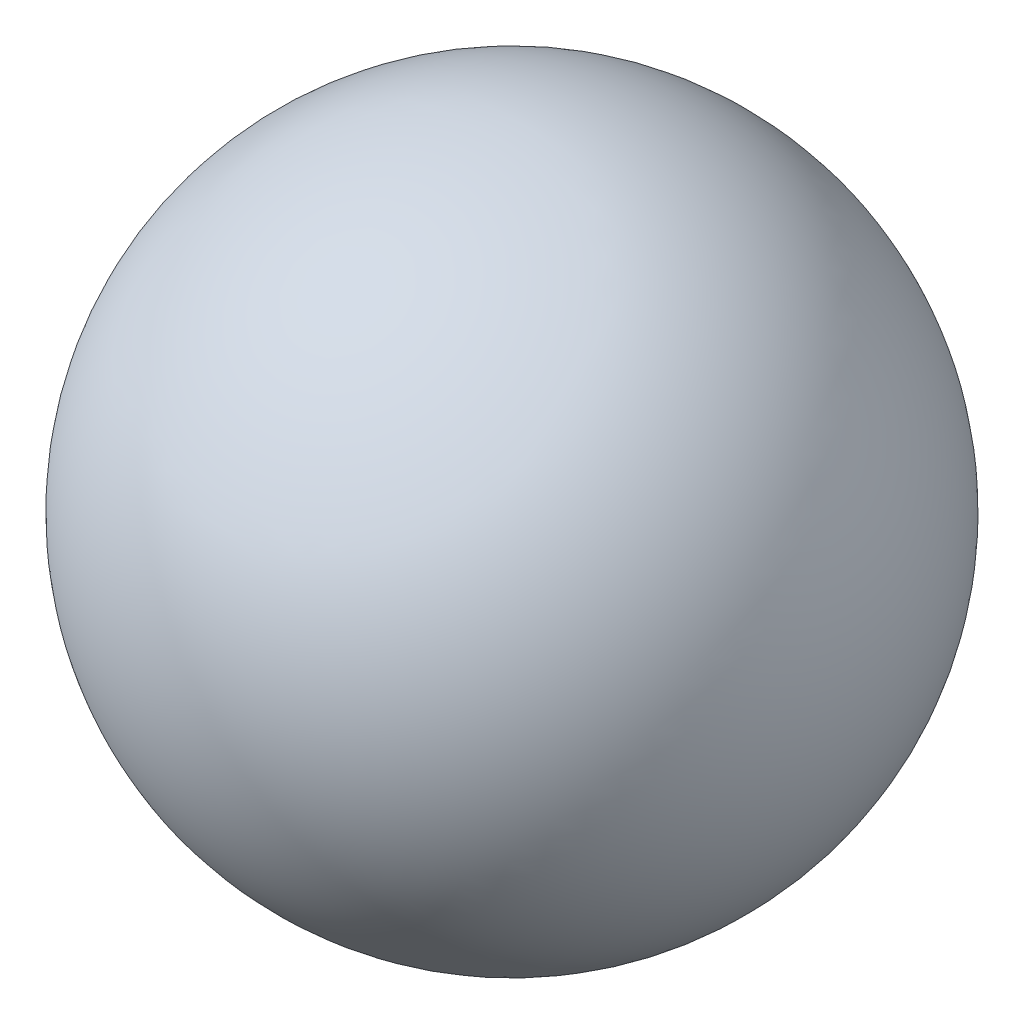
ISO-10303-21;
HEADER;
FILE_DESCRIPTION(('STEP AP214'),'2;1');
FILE_NAME('part.step','',(''),(''),'','','');
FILE_SCHEMA(('AUTOMOTIVE_DESIGN { 1 0 10303 214 1 1 1 1 }'));
ENDSEC;
DATA;
#1=APPLICATION_CONTEXT('core data for automotive mechanical design processes');
#2=APPLICATION_PROTOCOL_DEFINITION('international standard','automotive_design',2000,#1);
#3=PRODUCT_CONTEXT('',#1,'mechanical');
#4=PRODUCT('Part','Part','',(#3));
#5=PRODUCT_RELATED_PRODUCT_CATEGORY('part','',(#4));
#6=PRODUCT_DEFINITION_FORMATION('','',#4);
#7=PRODUCT_DEFINITION_CONTEXT('part definition',#1,'design');
#8=PRODUCT_DEFINITION('design','',#6,#7);
#9=PRODUCT_DEFINITION_SHAPE('','',#8);
#10=(LENGTH_UNIT() NAMED_UNIT(*) SI_UNIT(.MILLI.,.METRE.));
#11=(NAMED_UNIT(*) PLANE_ANGLE_UNIT() SI_UNIT($,.RADIAN.));
#12=(NAMED_UNIT(*) SI_UNIT($,.STERADIAN.) SOLID_ANGLE_UNIT());
#13=UNCERTAINTY_MEASURE_WITH_UNIT(LENGTH_MEASURE(1.E-05),#10,'distance_accuracy_value','');
#14=(GEOMETRIC_REPRESENTATION_CONTEXT(3) GLOBAL_UNCERTAINTY_ASSIGNED_CONTEXT((#13)) GLOBAL_UNIT_ASSIGNED_CONTEXT((#10,
#11,#12)) REPRESENTATION_CONTEXT('',''));
#15=CARTESIAN_POINT('',(0.,0.,0.));
#16=DIRECTION('',(0.,0.,1.));
#17=DIRECTION('',(1.,0.,0.));
#18=AXIS2_PLACEMENT_3D('',#15,#16,#17);
#19=CARTESIAN_POINT('',(0.,13.,0.));
#20=DIRECTION('',(0.,0.,1.));
#21=DIRECTION('',(0.,1.,0.));
#22=AXIS2_PLACEMENT_3D('',#19,#20,#21);
#23=SPHERICAL_SURFACE('',#22,1.90455682813241);
#24=CARTESIAN_POINT('',(0.,13.,1.90455682813241));
#25=VERTEX_POINT('',#24);
#26=VERTEX_LOOP('',#25);
#27=FACE_BOUND('',#26,.T.);
#28=ADVANCED_FACE('F35',(#27),#23,.T.);
#29=CLOSED_SHELL('',(#28));
#30=MANIFOLD_SOLID_BREP('B2',#29);
#31=ADVANCED_BREP_SHAPE_REPRESENTATION('',(#18,#30),#14);
#32=SHAPE_DEFINITION_REPRESENTATION(#9,#31);
ENDSEC;
END-ISO-10303-21;
